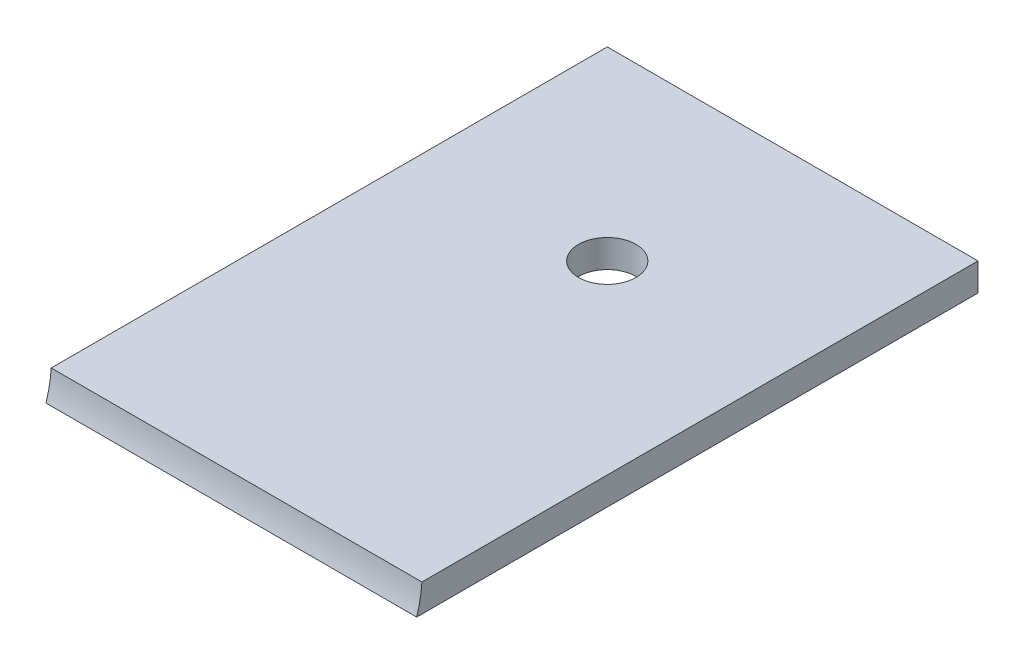
ISO-10303-21;
HEADER;
FILE_DESCRIPTION(('STEP AP214'),'2;1');
FILE_NAME('part.step','',(''),(''),'','','');
FILE_SCHEMA(('AUTOMOTIVE_DESIGN { 1 0 10303 214 1 1 1 1 }'));
ENDSEC;
DATA;
#1=APPLICATION_CONTEXT('core data for automotive mechanical design processes');
#2=APPLICATION_PROTOCOL_DEFINITION('international standard','automotive_design',2000,#1);
#3=PRODUCT_CONTEXT('',#1,'mechanical');
#4=PRODUCT('Part','Part','',(#3));
#5=PRODUCT_RELATED_PRODUCT_CATEGORY('part','',(#4));
#6=PRODUCT_DEFINITION_FORMATION('','',#4);
#7=PRODUCT_DEFINITION_CONTEXT('part definition',#1,'design');
#8=PRODUCT_DEFINITION('design','',#6,#7);
#9=PRODUCT_DEFINITION_SHAPE('','',#8);
#10=(LENGTH_UNIT() NAMED_UNIT(*) SI_UNIT(.MILLI.,.METRE.));
#11=(NAMED_UNIT(*) PLANE_ANGLE_UNIT() SI_UNIT($,.RADIAN.));
#12=(NAMED_UNIT(*) SI_UNIT($,.STERADIAN.) SOLID_ANGLE_UNIT());
#13=UNCERTAINTY_MEASURE_WITH_UNIT(LENGTH_MEASURE(1.E-05),#10,'distance_accuracy_value','');
#14=(GEOMETRIC_REPRESENTATION_CONTEXT(3) GLOBAL_UNCERTAINTY_ASSIGNED_CONTEXT((#13)) GLOBAL_UNIT_ASSIGNED_CONTEXT((#10,
#11,#12)) REPRESENTATION_CONTEXT('',''));
#15=CARTESIAN_POINT('',(0.,0.,0.));
#16=DIRECTION('',(0.,0.,1.));
#17=DIRECTION('',(1.,0.,0.));
#18=AXIS2_PLACEMENT_3D('',#15,#16,#17);
#19=CARTESIAN_POINT('',(0.,3.,0.));
#20=DIRECTION('',(0.,1.,0.));
#21=DIRECTION('',(0.,0.,1.));
#22=AXIS2_PLACEMENT_3D('',#19,#20,#21);
#23=PLANE('',#22);
#24=DIRECTION('',(0.,0.,-1.));
#25=VECTOR('',#24,1.);
#26=CARTESIAN_POINT('',(20.,3.,-30.));
#27=LINE('',#26,#25);
#28=CARTESIAN_POINT('',(20.,3.,30.));
#29=VERTEX_POINT('',#28);
#30=CARTESIAN_POINT('',(20.,3.,-30.));
#31=VERTEX_POINT('',#30);
#32=EDGE_CURVE('E93',#29,#31,#27,.T.);
#33=ORIENTED_EDGE('',*,*,#32,.T.);
#34=DIRECTION('',(-1.,0.,0.));
#35=VECTOR('',#34,1.);
#36=CARTESIAN_POINT('',(-20.,3.,-30.));
#37=LINE('',#36,#35);
#38=CARTESIAN_POINT('',(-20.,3.,-30.));
#39=VERTEX_POINT('',#38);
#40=EDGE_CURVE('E88',#31,#39,#37,.T.);
#41=ORIENTED_EDGE('',*,*,#40,.T.);
#42=DIRECTION('',(0.,0.,1.));
#43=VECTOR('',#42,1.);
#44=CARTESIAN_POINT('',(-20.,3.,-30.));
#45=LINE('',#44,#43);
#46=CARTESIAN_POINT('',(-20.,3.,30.));
#47=VERTEX_POINT('',#46);
#48=EDGE_CURVE('E92',#39,#47,#45,.T.);
#49=ORIENTED_EDGE('',*,*,#48,.T.);
#50=DIRECTION('',(1.,0.,0.));
#51=VECTOR('',#50,1.);
#52=CARTESIAN_POINT('',(-20.,3.,30.));
#53=LINE('',#52,#51);
#54=EDGE_CURVE('E62',#47,#29,#53,.T.);
#55=ORIENTED_EDGE('',*,*,#54,.T.);
#56=EDGE_LOOP('',(#33,#41,#49,#55));
#57=FACE_BOUND('',#56,.T.);
#58=CARTESIAN_POINT('',(0.,3.,-10.));
#59=DIRECTION('',(0.,1.,0.));
#60=DIRECTION('',(0.,0.,1.));
#61=AXIS2_PLACEMENT_3D('',#58,#59,#60);
#62=CIRCLE('',#61,3.1);
#63=CARTESIAN_POINT('',(0.,3.,-6.9));
#64=VERTEX_POINT('',#63);
#65=EDGE_CURVE('E108',#64,#64,#62,.T.);
#66=ORIENTED_EDGE('',*,*,#65,.F.);
#67=EDGE_LOOP('',(#66));
#68=FACE_BOUND('',#67,.T.);
#69=ADVANCED_FACE('F45',(#57,#68),#23,.T.);
#70=CARTESIAN_POINT('',(0.,0.,0.));
#71=DIRECTION('',(0.,1.,0.));
#72=DIRECTION('',(0.,0.,1.));
#73=AXIS2_PLACEMENT_3D('',#70,#71,#72);
#74=PLANE('',#73);
#75=DIRECTION('',(0.,0.,-1.));
#76=VECTOR('',#75,1.);
#77=CARTESIAN_POINT('',(20.,0.,-30.));
#78=LINE('',#77,#76);
#79=CARTESIAN_POINT('',(20.,0.,30.5628750432113));
#80=VERTEX_POINT('',#79);
#81=CARTESIAN_POINT('',(20.,0.,-30.));
#82=VERTEX_POINT('',#81);
#83=EDGE_CURVE('E105',#80,#82,#78,.T.);
#84=ORIENTED_EDGE('',*,*,#83,.F.);
#85=DIRECTION('',(1.,0.,0.));
#86=VECTOR('',#85,1.);
#87=CARTESIAN_POINT('',(-23.052348000191,0.,30.5628750432113));
#88=LINE('',#87,#86);
#89=CARTESIAN_POINT('',(-20.,0.,30.5628750432113));
#90=VERTEX_POINT('',#89);
#91=EDGE_CURVE('E117',#90,#80,#88,.T.);
#92=ORIENTED_EDGE('',*,*,#91,.F.);
#93=DIRECTION('',(0.,0.,1.));
#94=VECTOR('',#93,1.);
#95=CARTESIAN_POINT('',(-20.,0.,-30.));
#96=LINE('',#95,#94);
#97=CARTESIAN_POINT('',(-20.,0.,-30.));
#98=VERTEX_POINT('',#97);
#99=EDGE_CURVE('E82',#98,#90,#96,.T.);
#100=ORIENTED_EDGE('',*,*,#99,.F.);
#101=DIRECTION('',(-1.,0.,0.));
#102=VECTOR('',#101,1.);
#103=CARTESIAN_POINT('',(-20.,0.,-30.));
#104=LINE('',#103,#102);
#105=EDGE_CURVE('E74',#82,#98,#104,.T.);
#106=ORIENTED_EDGE('',*,*,#105,.F.);
#107=EDGE_LOOP('',(#84,#92,#100,#106));
#108=FACE_BOUND('',#107,.T.);
#109=CARTESIAN_POINT('',(0.,0.,-10.));
#110=DIRECTION('',(0.,1.,0.));
#111=DIRECTION('',(0.,0.,1.));
#112=AXIS2_PLACEMENT_3D('',#109,#110,#111);
#113=CIRCLE('',#112,3.1);
#114=CARTESIAN_POINT('',(0.,0.,-6.9));
#115=VERTEX_POINT('',#114);
#116=EDGE_CURVE('E111',#115,#115,#113,.T.);
#117=ORIENTED_EDGE('',*,*,#116,.T.);
#118=EDGE_LOOP('',(#117));
#119=FACE_BOUND('',#118,.T.);
#120=ADVANCED_FACE('F126',(#108,#119),#74,.F.);
#121=CARTESIAN_POINT('',(20.,3.,-30.));
#122=DIRECTION('',(-1.,0.,0.));
#123=DIRECTION('',(0.,0.,1.));
#124=AXIS2_PLACEMENT_3D('',#121,#122,#123);
#125=PLANE('',#124);
#126=ORIENTED_EDGE('',*,*,#83,.T.);
#127=DIRECTION('',(0.,-1.,0.));
#128=VECTOR('',#127,1.);
#129=CARTESIAN_POINT('',(20.,3.,-30.));
#130=LINE('',#129,#128);
#131=EDGE_CURVE('E11',#31,#82,#130,.T.);
#132=ORIENTED_EDGE('',*,*,#131,.F.);
#133=ORIENTED_EDGE('',*,*,#32,.F.);
#134=CARTESIAN_POINT('',(20.,3.82500000000002,42.67317541108));
#135=DIRECTION('',(-1.,0.,0.));
#136=DIRECTION('',(0.,0.,-1.));
#137=AXIS2_PLACEMENT_3D('',#134,#135,#136);
#138=CIRCLE('',#137,12.7);
#139=EDGE_CURVE('E120',#29,#80,#138,.T.);
#140=ORIENTED_EDGE('',*,*,#139,.T.);
#141=EDGE_LOOP('',(#126,#132,#133,#140));
#142=FACE_BOUND('',#141,.T.);
#143=ADVANCED_FACE('F47',(#142),#125,.F.);
#144=CARTESIAN_POINT('',(-20.,3.,-30.));
#145=DIRECTION('',(0.,0.,1.));
#146=DIRECTION('',(1.,0.,0.));
#147=AXIS2_PLACEMENT_3D('',#144,#145,#146);
#148=PLANE('',#147);
#149=ORIENTED_EDGE('',*,*,#105,.T.);
#150=DIRECTION('',(0.,-1.,0.));
#151=VECTOR('',#150,1.);
#152=CARTESIAN_POINT('',(-20.,3.,-30.));
#153=LINE('',#152,#151);
#154=EDGE_CURVE('E54',#39,#98,#153,.T.);
#155=ORIENTED_EDGE('',*,*,#154,.F.);
#156=ORIENTED_EDGE('',*,*,#40,.F.);
#157=ORIENTED_EDGE('',*,*,#131,.T.);
#158=EDGE_LOOP('',(#149,#155,#156,#157));
#159=FACE_BOUND('',#158,.T.);
#160=ADVANCED_FACE('F97',(#159),#148,.F.);
#161=CARTESIAN_POINT('',(-20.,3.,-30.));
#162=DIRECTION('',(1.,0.,0.));
#163=DIRECTION('',(0.,0.,-1.));
#164=AXIS2_PLACEMENT_3D('',#161,#162,#163);
#165=PLANE('',#164);
#166=ORIENTED_EDGE('',*,*,#99,.T.);
#167=CARTESIAN_POINT('',(-20.,3.82500000000002,42.67317541108));
#168=DIRECTION('',(1.,0.,0.));
#169=DIRECTION('',(0.,0.,-1.));
#170=AXIS2_PLACEMENT_3D('',#167,#168,#169);
#171=CIRCLE('',#170,12.7);
#172=EDGE_CURVE('E100',#90,#47,#171,.T.);
#173=ORIENTED_EDGE('',*,*,#172,.T.);
#174=ORIENTED_EDGE('',*,*,#48,.F.);
#175=ORIENTED_EDGE('',*,*,#154,.T.);
#176=EDGE_LOOP('',(#166,#173,#174,#175));
#177=FACE_BOUND('',#176,.T.);
#178=ADVANCED_FACE('F98',(#177),#165,.F.);
#179=CARTESIAN_POINT('',(0.,3.,-10.));
#180=DIRECTION('',(0.,-1.,0.));
#181=DIRECTION('',(0.,0.,-1.));
#182=AXIS2_PLACEMENT_3D('',#179,#180,#181);
#183=CYLINDRICAL_SURFACE('',#182,3.1);
#184=ORIENTED_EDGE('',*,*,#65,.T.);
#185=EDGE_LOOP('',(#184));
#186=FACE_BOUND('',#185,.T.);
#187=ORIENTED_EDGE('',*,*,#116,.F.);
#188=EDGE_LOOP('',(#187));
#189=FACE_BOUND('',#188,.T.);
#190=ADVANCED_FACE('F132',(#186,#189),#183,.F.);
#191=CARTESIAN_POINT('',(-23.052348000191,3.82500000000002,42.67317541108));
#192=DIRECTION('',(1.,0.,0.));
#193=DIRECTION('',(0.,0.,-1.));
#194=AXIS2_PLACEMENT_3D('',#191,#192,#193);
#195=CYLINDRICAL_SURFACE('',#194,12.7);
#196=ORIENTED_EDGE('',*,*,#172,.F.);
#197=ORIENTED_EDGE('',*,*,#91,.T.);
#198=ORIENTED_EDGE('',*,*,#139,.F.);
#199=ORIENTED_EDGE('',*,*,#54,.F.);
#200=EDGE_LOOP('',(#196,#197,#198,#199));
#201=FACE_BOUND('',#200,.T.);
#202=ADVANCED_FACE('F125',(#201),#195,.F.);
#203=CLOSED_SHELL('',(#69,#120,#143,#160,#178,#190,#202));
#204=MANIFOLD_SOLID_BREP('B2',#203);
#205=ADVANCED_BREP_SHAPE_REPRESENTATION('',(#18,#204),#14);
#206=SHAPE_DEFINITION_REPRESENTATION(#9,#205);
ENDSEC;
END-ISO-10303-21;
